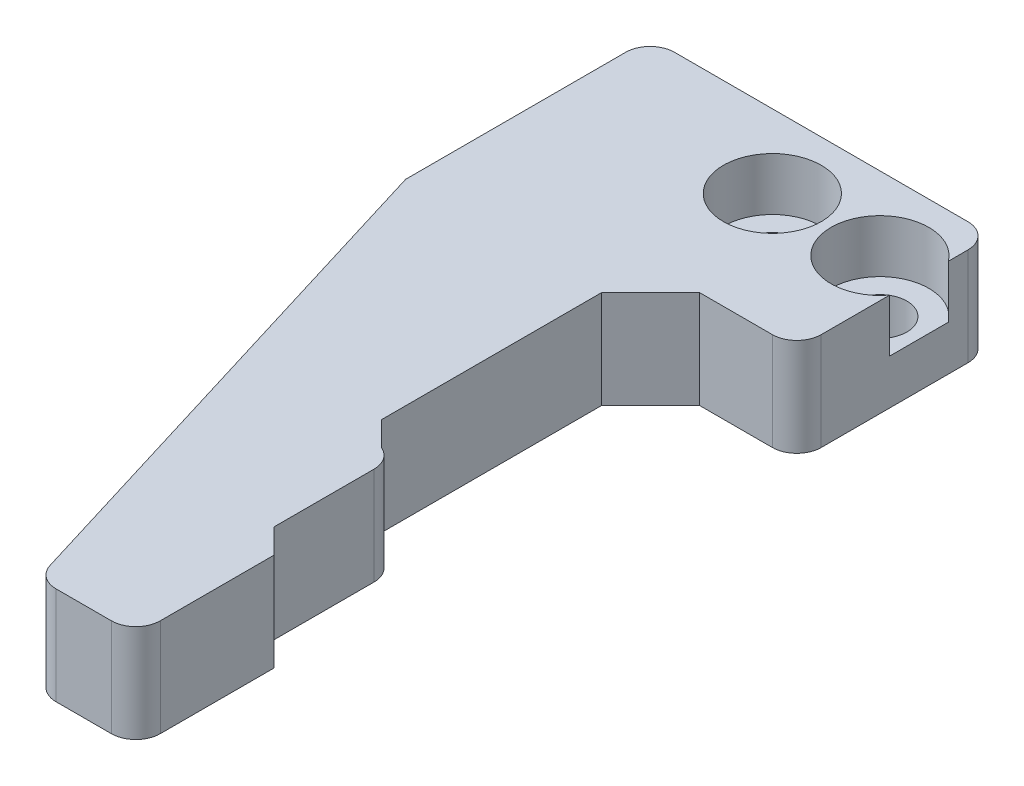
ISO-10303-21;
HEADER;
FILE_DESCRIPTION(('STEP AP214'),'2;1');
FILE_NAME('part.step','',(''),(''),'','','');
FILE_SCHEMA(('AUTOMOTIVE_DESIGN { 1 0 10303 214 1 1 1 1 }'));
ENDSEC;
DATA;
#1=APPLICATION_CONTEXT('core data for automotive mechanical design processes');
#2=APPLICATION_PROTOCOL_DEFINITION('international standard','automotive_design',2000,#1);
#3=PRODUCT_CONTEXT('',#1,'mechanical');
#4=PRODUCT('Part','Part','',(#3));
#5=PRODUCT_RELATED_PRODUCT_CATEGORY('part','',(#4));
#6=PRODUCT_DEFINITION_FORMATION('','',#4);
#7=PRODUCT_DEFINITION_CONTEXT('part definition',#1,'design');
#8=PRODUCT_DEFINITION('design','',#6,#7);
#9=PRODUCT_DEFINITION_SHAPE('','',#8);
#10=(LENGTH_UNIT() NAMED_UNIT(*) SI_UNIT(.MILLI.,.METRE.));
#11=(NAMED_UNIT(*) PLANE_ANGLE_UNIT() SI_UNIT($,.RADIAN.));
#12=(NAMED_UNIT(*) SI_UNIT($,.STERADIAN.) SOLID_ANGLE_UNIT());
#13=UNCERTAINTY_MEASURE_WITH_UNIT(LENGTH_MEASURE(1.E-05),#10,'distance_accuracy_value','');
#14=(GEOMETRIC_REPRESENTATION_CONTEXT(3) GLOBAL_UNCERTAINTY_ASSIGNED_CONTEXT((#13)) GLOBAL_UNIT_ASSIGNED_CONTEXT((#10,
#11,#12)) REPRESENTATION_CONTEXT('',''));
#15=CARTESIAN_POINT('',(0.,0.,0.));
#16=DIRECTION('',(0.,0.,1.));
#17=DIRECTION('',(1.,0.,0.));
#18=AXIS2_PLACEMENT_3D('',#15,#16,#17);
#19=CARTESIAN_POINT('',(0.,10.,-59.1354626519124));
#20=DIRECTION('',(-1.,0.,0.));
#21=DIRECTION('',(0.,0.,1.));
#22=AXIS2_PLACEMENT_3D('',#19,#20,#21);
#23=PLANE('',#22);
#24=DIRECTION('',(0.,0.,1.));
#25=VECTOR('',#24,1.);
#26=CARTESIAN_POINT('',(0.,4.6,-59.1354626519124));
#27=LINE('',#26,#25);
#28=CARTESIAN_POINT('',(0.,4.6,-74.6354626519124));
#29=VERTEX_POINT('',#28);
#30=CARTESIAN_POINT('',(0.,4.6,-68.6354626519124));
#31=VERTEX_POINT('',#30);
#32=EDGE_CURVE('E11',#29,#31,#27,.T.);
#33=ORIENTED_EDGE('',*,*,#32,.T.);
#34=DIRECTION('',(0.,1.,0.));
#35=VECTOR('',#34,1.);
#36=CARTESIAN_POINT('',(0.,10.,-68.6354626519124));
#37=LINE('',#36,#35);
#38=CARTESIAN_POINT('',(0.,10.,-68.6354626519124));
#39=VERTEX_POINT('',#38);
#40=EDGE_CURVE('E173',#31,#39,#37,.T.);
#41=ORIENTED_EDGE('',*,*,#40,.T.);
#42=DIRECTION('',(0.,0.,-1.));
#43=VECTOR('',#42,1.);
#44=CARTESIAN_POINT('',(0.,10.,-59.1354626519124));
#45=LINE('',#44,#43);
#46=CARTESIAN_POINT('',(0.,10.,-61.6354626519124));
#47=VERTEX_POINT('',#46);
#48=EDGE_CURVE('E196',#47,#39,#45,.T.);
#49=ORIENTED_EDGE('',*,*,#48,.F.);
#50=DIRECTION('',(0.,-1.,0.));
#51=VECTOR('',#50,1.);
#52=CARTESIAN_POINT('',(0.,10.,-61.6354626519124));
#53=LINE('',#52,#51);
#54=CARTESIAN_POINT('',(0.,0.,-61.6354626519124));
#55=VERTEX_POINT('',#54);
#56=EDGE_CURVE('E293',#47,#55,#53,.T.);
#57=ORIENTED_EDGE('',*,*,#56,.T.);
#58=DIRECTION('',(0.,0.,-1.));
#59=VECTOR('',#58,1.);
#60=CARTESIAN_POINT('',(0.,0.,-59.1354626519124));
#61=LINE('',#60,#59);
#62=CARTESIAN_POINT('',(0.,0.,-76.6354626519124));
#63=VERTEX_POINT('',#62);
#64=EDGE_CURVE('E180',#55,#63,#61,.T.);
#65=ORIENTED_EDGE('',*,*,#64,.T.);
#66=DIRECTION('',(0.,-1.,0.));
#67=VECTOR('',#66,1.);
#68=CARTESIAN_POINT('',(0.,10.,-76.6354626519124));
#69=LINE('',#68,#67);
#70=CARTESIAN_POINT('',(0.,10.,-76.6354626519124));
#71=VERTEX_POINT('',#70);
#72=EDGE_CURVE('E296',#63,#71,#69,.F.);
#73=ORIENTED_EDGE('',*,*,#72,.T.);
#74=CARTESIAN_POINT('',(0.,10.,-74.6354626519124));
#75=VERTEX_POINT('',#74);
#76=EDGE_CURVE('E189',#75,#71,#45,.T.);
#77=ORIENTED_EDGE('',*,*,#76,.F.);
#78=DIRECTION('',(0.,1.,0.));
#79=VECTOR('',#78,1.);
#80=CARTESIAN_POINT('',(0.,10.,-74.6354626519124));
#81=LINE('',#80,#79);
#82=EDGE_CURVE('E50',#75,#29,#81,.F.);
#83=ORIENTED_EDGE('',*,*,#82,.T.);
#84=EDGE_LOOP('',(#33,#41,#49,#57,#65,#73,#77,#83));
#85=FACE_BOUND('',#84,.T.);
#86=ADVANCED_FACE('F35',(#85),#23,.F.);
#87=CARTESIAN_POINT('',(0.,10.,-79.1354626519124));
#88=DIRECTION('',(0.,0.,1.));
#89=DIRECTION('',(1.,0.,0.));
#90=AXIS2_PLACEMENT_3D('',#87,#88,#89);
#91=PLANE('',#90);
#92=DIRECTION('',(-1.,0.,0.));
#93=VECTOR('',#92,1.);
#94=CARTESIAN_POINT('',(0.,10.,-79.1354626519124));
#95=LINE('',#94,#93);
#96=CARTESIAN_POINT('',(-2.5,10.,-79.1354626519124));
#97=VERTEX_POINT('',#96);
#98=CARTESIAN_POINT('',(-32.5,10.,-79.1354626519124));
#99=VERTEX_POINT('',#98);
#100=EDGE_CURVE('E198',#97,#99,#95,.T.);
#101=ORIENTED_EDGE('',*,*,#100,.F.);
#102=DIRECTION('',(0.,-1.,0.));
#103=VECTOR('',#102,1.);
#104=CARTESIAN_POINT('',(-2.5,10.,-79.1354626519124));
#105=LINE('',#104,#103);
#106=CARTESIAN_POINT('',(-2.5,0.,-79.1354626519124));
#107=VERTEX_POINT('',#106);
#108=EDGE_CURVE('E278',#97,#107,#105,.T.);
#109=ORIENTED_EDGE('',*,*,#108,.T.);
#110=DIRECTION('',(-1.,0.,0.));
#111=VECTOR('',#110,1.);
#112=CARTESIAN_POINT('',(0.,0.,-79.1354626519124));
#113=LINE('',#112,#111);
#114=CARTESIAN_POINT('',(-32.5,0.,-79.1354626519124));
#115=VERTEX_POINT('',#114);
#116=EDGE_CURVE('E221',#107,#115,#113,.T.);
#117=ORIENTED_EDGE('',*,*,#116,.T.);
#118=DIRECTION('',(0.,-1.,0.));
#119=VECTOR('',#118,1.);
#120=CARTESIAN_POINT('',(-32.5,10.,-79.1354626519124));
#121=LINE('',#120,#119);
#122=EDGE_CURVE('E276',#115,#99,#121,.F.);
#123=ORIENTED_EDGE('',*,*,#122,.T.);
#124=EDGE_LOOP('',(#101,#109,#117,#123));
#125=FACE_BOUND('',#124,.T.);
#126=ADVANCED_FACE('F367',(#125),#91,.F.);
#127=CARTESIAN_POINT('',(-35.,10.,-54.1354626519124));
#128=DIRECTION('',(1.,0.,0.));
#129=DIRECTION('',(0.,0.,-1.));
#130=AXIS2_PLACEMENT_3D('',#127,#128,#129);
#131=PLANE('',#130);
#132=DIRECTION('',(0.,0.,1.));
#133=VECTOR('',#132,1.);
#134=CARTESIAN_POINT('',(-35.,10.,-54.1354626519124));
#135=LINE('',#134,#133);
#136=CARTESIAN_POINT('',(-35.,10.,-76.6354626519124));
#137=VERTEX_POINT('',#136);
#138=CARTESIAN_POINT('',(-35.,10.,-54.1354626519124));
#139=VERTEX_POINT('',#138);
#140=EDGE_CURVE('E201',#137,#139,#135,.T.);
#141=ORIENTED_EDGE('',*,*,#140,.F.);
#142=DIRECTION('',(0.,-1.,0.));
#143=VECTOR('',#142,1.);
#144=CARTESIAN_POINT('',(-35.,10.,-76.6354626519124));
#145=LINE('',#144,#143);
#146=CARTESIAN_POINT('',(-35.,0.,-76.6354626519124));
#147=VERTEX_POINT('',#146);
#148=EDGE_CURVE('E320',#137,#147,#145,.T.);
#149=ORIENTED_EDGE('',*,*,#148,.T.);
#150=DIRECTION('',(0.,0.,1.));
#151=VECTOR('',#150,1.);
#152=CARTESIAN_POINT('',(-35.,0.,-54.1354626519124));
#153=LINE('',#152,#151);
#154=CARTESIAN_POINT('',(-35.,0.,-54.1354626519124));
#155=VERTEX_POINT('',#154);
#156=EDGE_CURVE('E224',#147,#155,#153,.T.);
#157=ORIENTED_EDGE('',*,*,#156,.T.);
#158=DIRECTION('',(0.,-1.,0.));
#159=VECTOR('',#158,1.);
#160=CARTESIAN_POINT('',(-35.,10.,-54.1354626519124));
#161=LINE('',#160,#159);
#162=EDGE_CURVE('E243',#139,#155,#161,.T.);
#163=ORIENTED_EDGE('',*,*,#162,.F.);
#164=EDGE_LOOP('',(#141,#149,#157,#163));
#165=FACE_BOUND('',#164,.T.);
#166=ADVANCED_FACE('F377',(#165),#131,.F.);
#167=CARTESIAN_POINT('',(-18.45,10.,0.));
#168=DIRECTION('',(0.956309062202119,0.,-0.292357619278349));
#169=DIRECTION('',(-0.292357619278349,0.,-0.956309062202119));
#170=AXIS2_PLACEMENT_3D('',#167,#168,#169);
#171=PLANE('',#170);
#172=DIRECTION('',(0.292357619278349,0.,0.956309062202119));
#173=VECTOR('',#172,1.);
#174=CARTESIAN_POINT('',(-18.45,0.,0.));
#175=LINE('',#174,#173);
#176=CARTESIAN_POINT('',(-18.9908414755891,0.,-1.76910595180413));
#177=VERTEX_POINT('',#176);
#178=EDGE_CURVE('E226',#155,#177,#175,.T.);
#179=ORIENTED_EDGE('',*,*,#178,.T.);
#180=DIRECTION('',(0.,-1.,0.));
#181=VECTOR('',#180,1.);
#182=CARTESIAN_POINT('',(-18.9908414755891,10.,-1.76910595180413));
#183=LINE('',#182,#181);
#184=CARTESIAN_POINT('',(-18.9908414755891,10.,-1.76910595180413));
#185=VERTEX_POINT('',#184);
#186=EDGE_CURVE('E318',#177,#185,#183,.F.);
#187=ORIENTED_EDGE('',*,*,#186,.T.);
#188=DIRECTION('',(0.292357619278349,0.,0.956309062202119));
#189=VECTOR('',#188,1.);
#190=CARTESIAN_POINT('',(-18.45,10.,0.));
#191=LINE('',#190,#189);
#192=EDGE_CURVE('E203',#139,#185,#191,.T.);
#193=ORIENTED_EDGE('',*,*,#192,.F.);
#194=ORIENTED_EDGE('',*,*,#162,.T.);
#195=EDGE_LOOP('',(#179,#187,#193,#194));
#196=FACE_BOUND('',#195,.T.);
#197=ADVANCED_FACE('F471',(#196),#171,.F.);
#198=CARTESIAN_POINT('',(-8.44999999999999,10.,0.));
#199=DIRECTION('',(0.,0.,-1.));
#200=DIRECTION('',(-1.,0.,0.));
#201=AXIS2_PLACEMENT_3D('',#198,#199,#200);
#202=PLANE('',#201);
#203=DIRECTION('',(1.,0.,0.));
#204=VECTOR('',#203,1.);
#205=CARTESIAN_POINT('',(-8.44999999999999,0.,0.));
#206=LINE('',#205,#204);
#207=CARTESIAN_POINT('',(-16.6000688200838,0.,0.));
#208=VERTEX_POINT('',#207);
#209=CARTESIAN_POINT('',(-10.95,0.,0.));
#210=VERTEX_POINT('',#209);
#211=EDGE_CURVE('E229',#208,#210,#206,.T.);
#212=ORIENTED_EDGE('',*,*,#211,.T.);
#213=DIRECTION('',(0.,-1.,0.));
#214=VECTOR('',#213,1.);
#215=CARTESIAN_POINT('',(-10.95,10.,0.));
#216=LINE('',#215,#214);
#217=CARTESIAN_POINT('',(-10.95,10.,0.));
#218=VERTEX_POINT('',#217);
#219=EDGE_CURVE('E316',#210,#218,#216,.F.);
#220=ORIENTED_EDGE('',*,*,#219,.T.);
#221=DIRECTION('',(1.,0.,0.));
#222=VECTOR('',#221,1.);
#223=CARTESIAN_POINT('',(-8.44999999999999,10.,0.));
#224=LINE('',#223,#222);
#225=CARTESIAN_POINT('',(-16.6000688200838,10.,0.));
#226=VERTEX_POINT('',#225);
#227=EDGE_CURVE('E206',#226,#218,#224,.T.);
#228=ORIENTED_EDGE('',*,*,#227,.F.);
#229=DIRECTION('',(0.,-1.,0.));
#230=VECTOR('',#229,1.);
#231=CARTESIAN_POINT('',(-16.6000688200838,10.,0.));
#232=LINE('',#231,#230);
#233=EDGE_CURVE('E313',#226,#208,#232,.T.);
#234=ORIENTED_EDGE('',*,*,#233,.T.);
#235=EDGE_LOOP('',(#212,#220,#228,#234));
#236=FACE_BOUND('',#235,.T.);
#237=ADVANCED_FACE('F389',(#236),#202,.F.);
#238=CARTESIAN_POINT('',(-8.44999999999999,10.,-14.1354626519124));
#239=DIRECTION('',(-1.,0.,0.));
#240=DIRECTION('',(0.,0.,1.));
#241=AXIS2_PLACEMENT_3D('',#238,#239,#240);
#242=PLANE('',#241);
#243=DIRECTION('',(0.,0.,-1.));
#244=VECTOR('',#243,1.);
#245=CARTESIAN_POINT('',(-8.44999999999999,10.,-14.1354626519124));
#246=LINE('',#245,#244);
#247=CARTESIAN_POINT('',(-8.44999999999999,10.,-2.5));
#248=VERTEX_POINT('',#247);
#249=CARTESIAN_POINT('',(-8.44999999999999,10.,-14.1354626519124));
#250=VERTEX_POINT('',#249);
#251=EDGE_CURVE('E209',#248,#250,#246,.T.);
#252=ORIENTED_EDGE('',*,*,#251,.F.);
#253=DIRECTION('',(0.,-1.,0.));
#254=VECTOR('',#253,1.);
#255=CARTESIAN_POINT('',(-8.44999999999999,10.,-2.5));
#256=LINE('',#255,#254);
#257=CARTESIAN_POINT('',(-8.44999999999999,0.,-2.5));
#258=VERTEX_POINT('',#257);
#259=EDGE_CURVE('E310',#248,#258,#256,.T.);
#260=ORIENTED_EDGE('',*,*,#259,.T.);
#261=DIRECTION('',(0.,0.,-1.));
#262=VECTOR('',#261,1.);
#263=CARTESIAN_POINT('',(-8.44999999999999,0.,-14.1354626519124));
#264=LINE('',#263,#262);
#265=CARTESIAN_POINT('',(-8.44999999999999,0.,-14.1354626519124));
#266=VERTEX_POINT('',#265);
#267=EDGE_CURVE('E232',#258,#266,#264,.T.);
#268=ORIENTED_EDGE('',*,*,#267,.T.);
#269=DIRECTION('',(0.,-1.,0.));
#270=VECTOR('',#269,1.);
#271=CARTESIAN_POINT('',(-8.44999999999999,10.,-14.1354626519124));
#272=LINE('',#271,#270);
#273=EDGE_CURVE('E218',#250,#266,#272,.T.);
#274=ORIENTED_EDGE('',*,*,#273,.F.);
#275=EDGE_LOOP('',(#252,#260,#268,#274));
#276=FACE_BOUND('',#275,.T.);
#277=ADVANCED_FACE('F398',(#276),#242,.F.);
#278=CARTESIAN_POINT('',(-10.95,10.,-29.1354626519124));
#279=DIRECTION('',(-1.,0.,0.));
#280=DIRECTION('',(0.,0.,1.));
#281=AXIS2_PLACEMENT_3D('',#278,#279,#280);
#282=PLANE('',#281);
#283=DIRECTION('',(0.,0.,-1.));
#284=VECTOR('',#283,1.);
#285=CARTESIAN_POINT('',(-10.95,0.,-29.1354626519124));
#286=LINE('',#285,#284);
#287=CARTESIAN_POINT('',(-10.95,0.,-16.6354626519124));
#288=VERTEX_POINT('',#287);
#289=CARTESIAN_POINT('',(-10.95,0.,-26.8441748044345));
#290=VERTEX_POINT('',#289);
#291=EDGE_CURVE('E234',#288,#290,#286,.T.);
#292=ORIENTED_EDGE('',*,*,#291,.T.);
#293=DIRECTION('',(0.,1.,0.));
#294=VECTOR('',#293,1.);
#295=CARTESIAN_POINT('',(-10.95,10.,-26.8441748044345));
#296=LINE('',#295,#294);
#297=CARTESIAN_POINT('',(-10.95,10.,-26.8441748044345));
#298=VERTEX_POINT('',#297);
#299=EDGE_CURVE('E324',#290,#298,#296,.T.);
#300=ORIENTED_EDGE('',*,*,#299,.T.);
#301=DIRECTION('',(0.,0.,-1.));
#302=VECTOR('',#301,1.);
#303=CARTESIAN_POINT('',(-10.95,10.,-29.1354626519124));
#304=LINE('',#303,#302);
#305=CARTESIAN_POINT('',(-10.95,10.,-16.6354626519124));
#306=VERTEX_POINT('',#305);
#307=EDGE_CURVE('E211',#306,#298,#304,.T.);
#308=ORIENTED_EDGE('',*,*,#307,.F.);
#309=DIRECTION('',(0.,-1.,0.));
#310=VECTOR('',#309,1.);
#311=CARTESIAN_POINT('',(-10.95,0.,-16.6354626519124));
#312=LINE('',#311,#310);
#313=EDGE_CURVE('E257',#306,#288,#312,.T.);
#314=ORIENTED_EDGE('',*,*,#313,.T.);
#315=EDGE_LOOP('',(#292,#300,#308,#314));
#316=FACE_BOUND('',#315,.T.);
#317=ADVANCED_FACE('F328',(#316),#282,.F.);
#318=CARTESIAN_POINT('',(-14.95,10.,-59.1354626519124));
#319=DIRECTION('',(-1.,0.,0.));
#320=DIRECTION('',(0.,0.,1.));
#321=AXIS2_PLACEMENT_3D('',#318,#319,#320);
#322=PLANE('',#321);
#323=DIRECTION('',(0.,0.,-1.));
#324=VECTOR('',#323,1.);
#325=CARTESIAN_POINT('',(-14.95,10.,-59.1354626519124));
#326=LINE('',#325,#324);
#327=CARTESIAN_POINT('',(-14.95,10.,-31.6354626519124));
#328=VERTEX_POINT('',#327);
#329=CARTESIAN_POINT('',(-14.95,10.,-54.1354626519124));
#330=VERTEX_POINT('',#329);
#331=EDGE_CURVE('E214',#328,#330,#326,.T.);
#332=ORIENTED_EDGE('',*,*,#331,.F.);
#333=DIRECTION('',(0.,-1.,0.));
#334=VECTOR('',#333,1.);
#335=CARTESIAN_POINT('',(-14.95,0.,-31.6354626519124));
#336=LINE('',#335,#334);
#337=CARTESIAN_POINT('',(-14.95,0.,-31.6354626519124));
#338=VERTEX_POINT('',#337);
#339=EDGE_CURVE('E260',#328,#338,#336,.T.);
#340=ORIENTED_EDGE('',*,*,#339,.T.);
#341=DIRECTION('',(0.,0.,-1.));
#342=VECTOR('',#341,1.);
#343=CARTESIAN_POINT('',(-14.95,0.,-59.1354626519124));
#344=LINE('',#343,#342);
#345=CARTESIAN_POINT('',(-14.95,0.,-54.1354626519124));
#346=VERTEX_POINT('',#345);
#347=EDGE_CURVE('E237',#338,#346,#344,.T.);
#348=ORIENTED_EDGE('',*,*,#347,.T.);
#349=DIRECTION('',(0.,1.,0.));
#350=VECTOR('',#349,1.);
#351=CARTESIAN_POINT('',(-14.95,10.,-54.1354626519124));
#352=LINE('',#351,#350);
#353=EDGE_CURVE('E249',#346,#330,#352,.T.);
#354=ORIENTED_EDGE('',*,*,#353,.T.);
#355=EDGE_LOOP('',(#332,#340,#348,#354));
#356=FACE_BOUND('',#355,.T.);
#357=ADVANCED_FACE('F343',(#356),#322,.F.);
#358=CARTESIAN_POINT('',(0.,10.,-59.1354626519124));
#359=DIRECTION('',(0.,0.,-1.));
#360=DIRECTION('',(-1.,0.,0.));
#361=AXIS2_PLACEMENT_3D('',#358,#359,#360);
#362=PLANE('',#361);
#363=DIRECTION('',(1.,0.,0.));
#364=VECTOR('',#363,1.);
#365=CARTESIAN_POINT('',(0.,0.,-59.1354626519124));
#366=LINE('',#365,#364);
#367=CARTESIAN_POINT('',(-9.94999999999997,0.,-59.1354626519124));
#368=VERTEX_POINT('',#367);
#369=CARTESIAN_POINT('',(-2.5,0.,-59.1354626519124));
#370=VERTEX_POINT('',#369);
#371=EDGE_CURVE('E239',#368,#370,#366,.T.);
#372=ORIENTED_EDGE('',*,*,#371,.T.);
#373=DIRECTION('',(0.,-1.,0.));
#374=VECTOR('',#373,1.);
#375=CARTESIAN_POINT('',(-2.5,10.,-59.1354626519124));
#376=LINE('',#375,#374);
#377=CARTESIAN_POINT('',(-2.5,10.,-59.1354626519124));
#378=VERTEX_POINT('',#377);
#379=EDGE_CURVE('E58',#370,#378,#376,.F.);
#380=ORIENTED_EDGE('',*,*,#379,.T.);
#381=DIRECTION('',(1.,0.,0.));
#382=VECTOR('',#381,1.);
#383=CARTESIAN_POINT('',(0.,10.,-59.1354626519124));
#384=LINE('',#383,#382);
#385=CARTESIAN_POINT('',(-9.94999999999997,10.,-59.1354626519124));
#386=VERTEX_POINT('',#385);
#387=EDGE_CURVE('E216',#386,#378,#384,.T.);
#388=ORIENTED_EDGE('',*,*,#387,.F.);
#389=DIRECTION('',(0.,-1.,0.));
#390=VECTOR('',#389,1.);
#391=CARTESIAN_POINT('',(-9.94999999999997,0.,-59.1354626519124));
#392=LINE('',#391,#390);
#393=EDGE_CURVE('E246',#386,#368,#392,.T.);
#394=ORIENTED_EDGE('',*,*,#393,.T.);
#395=EDGE_LOOP('',(#372,#380,#388,#394));
#396=FACE_BOUND('',#395,.T.);
#397=ADVANCED_FACE('F351',(#396),#362,.F.);
#398=CARTESIAN_POINT('',(0.,10.,0.));
#399=DIRECTION('',(0.,1.,0.));
#400=DIRECTION('',(0.,0.,1.));
#401=AXIS2_PLACEMENT_3D('',#398,#399,#400);
#402=PLANE('',#401);
#403=CARTESIAN_POINT('',(-15.,10.,-71.6354626519124));
#404=DIRECTION('',(0.,1.,0.));
#405=DIRECTION('',(0.,0.,1.));
#406=AXIS2_PLACEMENT_3D('',#403,#404,#405);
#407=CIRCLE('',#406,4.99999999999999);
#408=CARTESIAN_POINT('',(-15.,10.,-66.6354626519124));
#409=VERTEX_POINT('',#408);
#410=EDGE_CURVE('E607',#409,#409,#407,.T.);
#411=ORIENTED_EDGE('',*,*,#410,.F.);
#412=EDGE_LOOP('',(#411));
#413=FACE_BOUND('',#412,.T.);
#414=CARTESIAN_POINT('',(-3.99999999999999,10.,-71.6354626519124));
#415=DIRECTION('',(0.,1.,0.));
#416=DIRECTION('',(0.,0.,1.));
#417=AXIS2_PLACEMENT_3D('',#414,#415,#416);
#418=CIRCLE('',#417,4.99999999999999);
#419=EDGE_CURVE('E43',#75,#39,#418,.T.);
#420=ORIENTED_EDGE('',*,*,#419,.F.);
#421=ORIENTED_EDGE('',*,*,#76,.T.);
#422=CARTESIAN_POINT('',(-2.5,10.,-76.6354626519124));
#423=DIRECTION('',(0.,1.,0.));
#424=DIRECTION('',(0.,0.,1.));
#425=AXIS2_PLACEMENT_3D('',#422,#423,#424);
#426=CIRCLE('',#425,2.5);
#427=EDGE_CURVE('E308',#71,#97,#426,.T.);
#428=ORIENTED_EDGE('',*,*,#427,.T.);
#429=ORIENTED_EDGE('',*,*,#100,.T.);
#430=CARTESIAN_POINT('',(-32.5,10.,-76.6354626519124));
#431=DIRECTION('',(0.,1.,0.));
#432=DIRECTION('',(0.,0.,1.));
#433=AXIS2_PLACEMENT_3D('',#430,#431,#432);
#434=CIRCLE('',#433,2.5);
#435=EDGE_CURVE('E302',#99,#137,#434,.T.);
#436=ORIENTED_EDGE('',*,*,#435,.T.);
#437=ORIENTED_EDGE('',*,*,#140,.T.);
#438=ORIENTED_EDGE('',*,*,#192,.T.);
#439=CARTESIAN_POINT('',(-16.6000688200838,10.,-2.5));
#440=DIRECTION('',(0.,1.,0.));
#441=DIRECTION('',(0.,0.,1.));
#442=AXIS2_PLACEMENT_3D('',#439,#440,#441);
#443=CIRCLE('',#442,2.5);
#444=EDGE_CURVE('E304',#185,#226,#443,.T.);
#445=ORIENTED_EDGE('',*,*,#444,.T.);
#446=ORIENTED_EDGE('',*,*,#227,.T.);
#447=CARTESIAN_POINT('',(-10.95,10.,-2.5));
#448=DIRECTION('',(0.,1.,0.));
#449=DIRECTION('',(0.,0.,1.));
#450=AXIS2_PLACEMENT_3D('',#447,#448,#449);
#451=CIRCLE('',#450,2.5);
#452=EDGE_CURVE('E306',#218,#248,#451,.T.);
#453=ORIENTED_EDGE('',*,*,#452,.T.);
#454=ORIENTED_EDGE('',*,*,#251,.T.);
#455=DIRECTION('',(0.707106781186544,0.,0.707106781186551));
#456=VECTOR('',#455,1.);
#457=CARTESIAN_POINT('',(-10.95,10.,-16.6354626519124));
#458=LINE('',#457,#456);
#459=EDGE_CURVE('E269',#250,#306,#458,.F.);
#460=ORIENTED_EDGE('',*,*,#459,.T.);
#461=ORIENTED_EDGE('',*,*,#307,.T.);
#462=CARTESIAN_POINT('',(-13.45,10.,-26.8441748044345));
#463=DIRECTION('',(0.,1.,0.));
#464=DIRECTION('',(0.,0.,1.));
#465=AXIS2_PLACEMENT_3D('',#462,#463,#464);
#466=CIRCLE('',#465,2.5);
#467=CARTESIAN_POINT('',(-12.45,10.,-29.1354626519124));
#468=VERTEX_POINT('',#467);
#469=EDGE_CURVE('E298',#298,#468,#466,.T.);
#470=ORIENTED_EDGE('',*,*,#469,.T.);
#471=DIRECTION('',(0.707106781186543,0.,0.707106781186552));
#472=VECTOR('',#471,1.);
#473=CARTESIAN_POINT('',(-14.95,10.,-31.6354626519124));
#474=LINE('',#473,#472);
#475=EDGE_CURVE('E274',#468,#328,#474,.F.);
#476=ORIENTED_EDGE('',*,*,#475,.T.);
#477=ORIENTED_EDGE('',*,*,#331,.T.);
#478=DIRECTION('',(-0.707106781186551,0.,0.707106781186544));
#479=VECTOR('',#478,1.);
#480=CARTESIAN_POINT('',(-9.94999999999997,10.,-59.1354626519124));
#481=LINE('',#480,#479);
#482=EDGE_CURVE('E255',#330,#386,#481,.F.);
#483=ORIENTED_EDGE('',*,*,#482,.T.);
#484=ORIENTED_EDGE('',*,*,#387,.T.);
#485=CARTESIAN_POINT('',(-2.5,10.,-61.6354626519124));
#486=DIRECTION('',(0.,1.,0.));
#487=DIRECTION('',(0.,0.,1.));
#488=AXIS2_PLACEMENT_3D('',#485,#486,#487);
#489=CIRCLE('',#488,2.5);
#490=EDGE_CURVE('E300',#378,#47,#489,.T.);
#491=ORIENTED_EDGE('',*,*,#490,.T.);
#492=ORIENTED_EDGE('',*,*,#48,.T.);
#493=EDGE_LOOP('',(#420,#421,#428,#429,#436,#437,#438,#445,#446,#453,#454,#460,#461,#470,#476,
#477,#483,#484,#491,#492));
#494=FACE_BOUND('',#493,.T.);
#495=ADVANCED_FACE('F334',(#413,#494),#402,.T.);
#496=CARTESIAN_POINT('',(0.,0.,0.));
#497=DIRECTION('',(0.,1.,0.));
#498=DIRECTION('',(0.,0.,1.));
#499=AXIS2_PLACEMENT_3D('',#496,#497,#498);
#500=PLANE('',#499);
#501=CARTESIAN_POINT('',(-15.,0.,-71.6354626519124));
#502=DIRECTION('',(0.,1.,0.));
#503=DIRECTION('',(0.,0.,1.));
#504=AXIS2_PLACEMENT_3D('',#501,#502,#503);
#505=CIRCLE('',#504,2.75);
#506=CARTESIAN_POINT('',(-15.,0.,-68.8854626519124));
#507=VERTEX_POINT('',#506);
#508=EDGE_CURVE('E185',#507,#507,#505,.T.);
#509=ORIENTED_EDGE('',*,*,#508,.T.);
#510=EDGE_LOOP('',(#509));
#511=FACE_BOUND('',#510,.T.);
#512=CARTESIAN_POINT('',(-3.99999999999999,0.,-71.6354626519124));
#513=DIRECTION('',(0.,1.,0.));
#514=DIRECTION('',(0.,0.,1.));
#515=AXIS2_PLACEMENT_3D('',#512,#513,#514);
#516=CIRCLE('',#515,2.75);
#517=CARTESIAN_POINT('',(-3.99999999999999,0.,-68.8854626519124));
#518=VERTEX_POINT('',#517);
#519=EDGE_CURVE('E190',#518,#518,#516,.T.);
#520=ORIENTED_EDGE('',*,*,#519,.T.);
#521=EDGE_LOOP('',(#520));
#522=FACE_BOUND('',#521,.T.);
#523=ORIENTED_EDGE('',*,*,#116,.F.);
#524=CARTESIAN_POINT('',(-2.5,0.,-76.6354626519124));
#525=DIRECTION('',(0.,1.,0.));
#526=DIRECTION('',(0.,0.,1.));
#527=AXIS2_PLACEMENT_3D('',#524,#525,#526);
#528=CIRCLE('',#527,2.5);
#529=EDGE_CURVE('E291',#107,#63,#528,.F.);
#530=ORIENTED_EDGE('',*,*,#529,.T.);
#531=ORIENTED_EDGE('',*,*,#64,.F.);
#532=CARTESIAN_POINT('',(-2.5,0.,-61.6354626519124));
#533=DIRECTION('',(0.,1.,0.));
#534=DIRECTION('',(0.,0.,1.));
#535=AXIS2_PLACEMENT_3D('',#532,#533,#534);
#536=CIRCLE('',#535,2.5);
#537=EDGE_CURVE('E283',#55,#370,#536,.F.);
#538=ORIENTED_EDGE('',*,*,#537,.T.);
#539=ORIENTED_EDGE('',*,*,#371,.F.);
#540=DIRECTION('',(0.707106781186551,0.,-0.707106781186544));
#541=VECTOR('',#540,1.);
#542=CARTESIAN_POINT('',(-34.5427313259561,0.,-34.5427313259565));
#543=LINE('',#542,#541);
#544=EDGE_CURVE('E252',#368,#346,#543,.F.);
#545=ORIENTED_EDGE('',*,*,#544,.T.);
#546=ORIENTED_EDGE('',*,*,#347,.F.);
#547=DIRECTION('',(-0.707106781186543,0.,-0.707106781186552));
#548=VECTOR('',#547,1.);
#549=CARTESIAN_POINT('',(8.34273132595611,0.,-8.342731325956));
#550=LINE('',#549,#548);
#551=CARTESIAN_POINT('',(-12.45,0.,-29.1354626519124));
#552=VERTEX_POINT('',#551);
#553=EDGE_CURVE('E271',#338,#552,#550,.F.);
#554=ORIENTED_EDGE('',*,*,#553,.T.);
#555=CARTESIAN_POINT('',(-13.45,0.,-26.8441748044345));
#556=DIRECTION('',(0.,1.,0.));
#557=DIRECTION('',(0.,0.,1.));
#558=AXIS2_PLACEMENT_3D('',#555,#556,#557);
#559=CIRCLE('',#558,2.5);
#560=EDGE_CURVE('E281',#552,#290,#559,.F.);
#561=ORIENTED_EDGE('',*,*,#560,.T.);
#562=ORIENTED_EDGE('',*,*,#291,.F.);
#563=DIRECTION('',(-0.707106781186544,0.,-0.707106781186551));
#564=VECTOR('',#563,1.);
#565=CARTESIAN_POINT('',(2.84273132595616,0.,-2.84273132595613));
#566=LINE('',#565,#564);
#567=EDGE_CURVE('E266',#288,#266,#566,.F.);
#568=ORIENTED_EDGE('',*,*,#567,.T.);
#569=ORIENTED_EDGE('',*,*,#267,.F.);
#570=CARTESIAN_POINT('',(-10.95,0.,-2.5));
#571=DIRECTION('',(0.,1.,0.));
#572=DIRECTION('',(0.,0.,1.));
#573=AXIS2_PLACEMENT_3D('',#570,#571,#572);
#574=CIRCLE('',#573,2.5);
#575=EDGE_CURVE('E289',#258,#210,#574,.F.);
#576=ORIENTED_EDGE('',*,*,#575,.T.);
#577=ORIENTED_EDGE('',*,*,#211,.F.);
#578=CARTESIAN_POINT('',(-16.6000688200838,0.,-2.5));
#579=DIRECTION('',(0.,1.,0.));
#580=DIRECTION('',(0.,0.,1.));
#581=AXIS2_PLACEMENT_3D('',#578,#579,#580);
#582=CIRCLE('',#581,2.5);
#583=EDGE_CURVE('E287',#208,#177,#582,.F.);
#584=ORIENTED_EDGE('',*,*,#583,.T.);
#585=ORIENTED_EDGE('',*,*,#178,.F.);
#586=ORIENTED_EDGE('',*,*,#156,.F.);
#587=CARTESIAN_POINT('',(-32.5,0.,-76.6354626519124));
#588=DIRECTION('',(0.,1.,0.));
#589=DIRECTION('',(0.,0.,1.));
#590=AXIS2_PLACEMENT_3D('',#587,#588,#589);
#591=CIRCLE('',#590,2.5);
#592=EDGE_CURVE('E285',#147,#115,#591,.F.);
#593=ORIENTED_EDGE('',*,*,#592,.T.);
#594=EDGE_LOOP('',(#523,#530,#531,#538,#539,#545,#546,#554,#561,#562,#568,#569,#576,#577,#584,
#585,#586,#593));
#595=FACE_BOUND('',#594,.T.);
#596=ADVANCED_FACE('F355',(#511,#522,#595),#500,.F.);
#597=CARTESIAN_POINT('',(-9.94999999999997,10.,-59.1354626519124));
#598=DIRECTION('',(0.707106781186544,0.,0.707106781186551));
#599=DIRECTION('',(0.,1.,0.));
#600=AXIS2_PLACEMENT_3D('',#597,#598,#599);
#601=PLANE('',#600);
#602=ORIENTED_EDGE('',*,*,#482,.F.);
#603=ORIENTED_EDGE('',*,*,#353,.F.);
#604=ORIENTED_EDGE('',*,*,#544,.F.);
#605=ORIENTED_EDGE('',*,*,#393,.F.);
#606=EDGE_LOOP('',(#602,#603,#604,#605));
#607=FACE_BOUND('',#606,.T.);
#608=ADVANCED_FACE('F349',(#607),#601,.T.);
#609=CARTESIAN_POINT('',(-10.95,10.,-16.6354626519124));
#610=DIRECTION('',(0.707106781186551,0.,-0.707106781186543));
#611=DIRECTION('',(0.,1.,0.));
#612=AXIS2_PLACEMENT_3D('',#609,#610,#611);
#613=PLANE('',#612);
#614=ORIENTED_EDGE('',*,*,#459,.F.);
#615=ORIENTED_EDGE('',*,*,#273,.T.);
#616=ORIENTED_EDGE('',*,*,#567,.F.);
#617=ORIENTED_EDGE('',*,*,#313,.F.);
#618=EDGE_LOOP('',(#614,#615,#616,#617));
#619=FACE_BOUND('',#618,.T.);
#620=ADVANCED_FACE('F401',(#619),#613,.T.);
#621=CARTESIAN_POINT('',(-14.95,10.,-31.6354626519124));
#622=DIRECTION('',(0.707106781186552,0.,-0.707106781186543));
#623=DIRECTION('',(0.,1.,0.));
#624=AXIS2_PLACEMENT_3D('',#621,#622,#623);
#625=PLANE('',#624);
#626=ORIENTED_EDGE('',*,*,#475,.F.);
#627=DIRECTION('',(0.,1.,0.));
#628=VECTOR('',#627,1.);
#629=CARTESIAN_POINT('',(-12.45,10.,-29.1354626519124));
#630=LINE('',#629,#628);
#631=EDGE_CURVE('E263',#552,#468,#630,.T.);
#632=ORIENTED_EDGE('',*,*,#631,.F.);
#633=ORIENTED_EDGE('',*,*,#553,.F.);
#634=ORIENTED_EDGE('',*,*,#339,.F.);
#635=EDGE_LOOP('',(#626,#632,#633,#634));
#636=FACE_BOUND('',#635,.T.);
#637=ADVANCED_FACE('F339',(#636),#625,.T.);
#638=CARTESIAN_POINT('',(-2.5,10.,-76.6354626519124));
#639=DIRECTION('',(0.,-1.,0.));
#640=DIRECTION('',(0.,0.,-1.));
#641=AXIS2_PLACEMENT_3D('',#638,#639,#640);
#642=CYLINDRICAL_SURFACE('',#641,2.5);
#643=ORIENTED_EDGE('',*,*,#427,.F.);
#644=ORIENTED_EDGE('',*,*,#72,.F.);
#645=ORIENTED_EDGE('',*,*,#529,.F.);
#646=ORIENTED_EDGE('',*,*,#108,.F.);
#647=EDGE_LOOP('',(#643,#644,#645,#646));
#648=FACE_BOUND('',#647,.T.);
#649=ADVANCED_FACE('F365',(#648),#642,.T.);
#650=CARTESIAN_POINT('',(-10.95,10.,-2.5));
#651=DIRECTION('',(0.,-1.,0.));
#652=DIRECTION('',(0.,0.,-1.));
#653=AXIS2_PLACEMENT_3D('',#650,#651,#652);
#654=CYLINDRICAL_SURFACE('',#653,2.5);
#655=ORIENTED_EDGE('',*,*,#452,.F.);
#656=ORIENTED_EDGE('',*,*,#219,.F.);
#657=ORIENTED_EDGE('',*,*,#575,.F.);
#658=ORIENTED_EDGE('',*,*,#259,.F.);
#659=EDGE_LOOP('',(#655,#656,#657,#658));
#660=FACE_BOUND('',#659,.T.);
#661=ADVANCED_FACE('F395',(#660),#654,.T.);
#662=CARTESIAN_POINT('',(-16.6000688200838,10.,-2.5));
#663=DIRECTION('',(0.,-1.,0.));
#664=DIRECTION('',(0.,0.,-1.));
#665=AXIS2_PLACEMENT_3D('',#662,#663,#664);
#666=CYLINDRICAL_SURFACE('',#665,2.5);
#667=ORIENTED_EDGE('',*,*,#444,.F.);
#668=ORIENTED_EDGE('',*,*,#186,.F.);
#669=ORIENTED_EDGE('',*,*,#583,.F.);
#670=ORIENTED_EDGE('',*,*,#233,.F.);
#671=EDGE_LOOP('',(#667,#668,#669,#670));
#672=FACE_BOUND('',#671,.T.);
#673=ADVANCED_FACE('F386',(#672),#666,.T.);
#674=CARTESIAN_POINT('',(-32.5,10.,-76.6354626519124));
#675=DIRECTION('',(0.,-1.,0.));
#676=DIRECTION('',(0.,0.,-1.));
#677=AXIS2_PLACEMENT_3D('',#674,#675,#676);
#678=CYLINDRICAL_SURFACE('',#677,2.5);
#679=ORIENTED_EDGE('',*,*,#435,.F.);
#680=ORIENTED_EDGE('',*,*,#122,.F.);
#681=ORIENTED_EDGE('',*,*,#592,.F.);
#682=ORIENTED_EDGE('',*,*,#148,.F.);
#683=EDGE_LOOP('',(#679,#680,#681,#682));
#684=FACE_BOUND('',#683,.T.);
#685=ADVANCED_FACE('F374',(#684),#678,.T.);
#686=CARTESIAN_POINT('',(-2.5,10.,-61.6354626519124));
#687=DIRECTION('',(0.,-1.,0.));
#688=DIRECTION('',(0.,0.,-1.));
#689=AXIS2_PLACEMENT_3D('',#686,#687,#688);
#690=CYLINDRICAL_SURFACE('',#689,2.5);
#691=ORIENTED_EDGE('',*,*,#490,.F.);
#692=ORIENTED_EDGE('',*,*,#379,.F.);
#693=ORIENTED_EDGE('',*,*,#537,.F.);
#694=ORIENTED_EDGE('',*,*,#56,.F.);
#695=EDGE_LOOP('',(#691,#692,#693,#694));
#696=FACE_BOUND('',#695,.T.);
#697=ADVANCED_FACE('F359',(#696),#690,.T.);
#698=CARTESIAN_POINT('',(-13.45,10.,-26.8441748044345));
#699=DIRECTION('',(0.,1.,0.));
#700=DIRECTION('',(0.,0.,1.));
#701=AXIS2_PLACEMENT_3D('',#698,#699,#700);
#702=CYLINDRICAL_SURFACE('',#701,2.5);
#703=ORIENTED_EDGE('',*,*,#469,.F.);
#704=ORIENTED_EDGE('',*,*,#299,.F.);
#705=ORIENTED_EDGE('',*,*,#560,.F.);
#706=ORIENTED_EDGE('',*,*,#631,.T.);
#707=EDGE_LOOP('',(#703,#704,#705,#706));
#708=FACE_BOUND('',#707,.T.);
#709=ADVANCED_FACE('F37',(#708),#702,.T.);
#710=CARTESIAN_POINT('',(-1.24999999999999,4.6,-71.6354626519124));
#711=DIRECTION('',(0.,-1.,0.));
#712=DIRECTION('',(0.,0.,-1.));
#713=AXIS2_PLACEMENT_3D('',#710,#711,#712);
#714=PLANE('',#713);
#715=CARTESIAN_POINT('',(-3.99999999999999,4.6,-71.6354626519124));
#716=DIRECTION('',(0.,1.,0.));
#717=DIRECTION('',(0.,0.,1.));
#718=AXIS2_PLACEMENT_3D('',#715,#716,#717);
#719=CIRCLE('',#718,2.75);
#720=CARTESIAN_POINT('',(-3.99999999999999,4.6,-68.8854626519124));
#721=VERTEX_POINT('',#720);
#722=EDGE_CURVE('E184',#721,#721,#719,.T.);
#723=ORIENTED_EDGE('',*,*,#722,.F.);
#724=EDGE_LOOP('',(#723));
#725=FACE_BOUND('',#724,.T.);
#726=CARTESIAN_POINT('',(-3.99999999999999,4.6,-71.6354626519124));
#727=DIRECTION('',(0.,1.,0.));
#728=DIRECTION('',(0.,0.,1.));
#729=AXIS2_PLACEMENT_3D('',#726,#727,#728);
#730=CIRCLE('',#729,4.99999999999999);
#731=EDGE_CURVE('E176',#29,#31,#730,.T.);
#732=ORIENTED_EDGE('',*,*,#731,.T.);
#733=ORIENTED_EDGE('',*,*,#32,.F.);
#734=EDGE_LOOP('',(#732,#733));
#735=FACE_BOUND('',#734,.T.);
#736=ADVANCED_FACE('F183',(#725,#735),#714,.F.);
#737=CARTESIAN_POINT('',(-3.99999999999999,10.,-71.6354626519124));
#738=DIRECTION('',(0.,1.,0.));
#739=DIRECTION('',(0.,0.,1.));
#740=AXIS2_PLACEMENT_3D('',#737,#738,#739);
#741=CYLINDRICAL_SURFACE('',#740,4.99999999999999);
#742=ORIENTED_EDGE('',*,*,#731,.F.);
#743=ORIENTED_EDGE('',*,*,#82,.F.);
#744=ORIENTED_EDGE('',*,*,#419,.T.);
#745=ORIENTED_EDGE('',*,*,#40,.F.);
#746=EDGE_LOOP('',(#742,#743,#744,#745));
#747=FACE_BOUND('',#746,.T.);
#748=ADVANCED_FACE('F175',(#747),#741,.F.);
#749=CARTESIAN_POINT('',(-3.99999999999999,10.,-71.6354626519124));
#750=DIRECTION('',(0.,1.,0.));
#751=DIRECTION('',(0.,0.,1.));
#752=AXIS2_PLACEMENT_3D('',#749,#750,#751);
#753=CYLINDRICAL_SURFACE('',#752,2.75);
#754=ORIENTED_EDGE('',*,*,#519,.F.);
#755=EDGE_LOOP('',(#754));
#756=FACE_BOUND('',#755,.T.);
#757=ORIENTED_EDGE('',*,*,#722,.T.);
#758=EDGE_LOOP('',(#757));
#759=FACE_BOUND('',#758,.T.);
#760=ADVANCED_FACE('F446',(#756,#759),#753,.F.);
#761=CARTESIAN_POINT('',(-15.,10.,-71.6354626519124));
#762=DIRECTION('',(0.,1.,0.));
#763=DIRECTION('',(0.,0.,1.));
#764=AXIS2_PLACEMENT_3D('',#761,#762,#763);
#765=CYLINDRICAL_SURFACE('',#764,2.75);
#766=ORIENTED_EDGE('',*,*,#508,.F.);
#767=EDGE_LOOP('',(#766));
#768=FACE_BOUND('',#767,.T.);
#769=CARTESIAN_POINT('',(-15.,4.6,-71.6354626519124));
#770=DIRECTION('',(0.,1.,0.));
#771=DIRECTION('',(0.,0.,1.));
#772=AXIS2_PLACEMENT_3D('',#769,#770,#771);
#773=CIRCLE('',#772,2.75);
#774=CARTESIAN_POINT('',(-15.,4.6,-68.8854626519124));
#775=VERTEX_POINT('',#774);
#776=EDGE_CURVE('E609',#775,#775,#773,.T.);
#777=ORIENTED_EDGE('',*,*,#776,.T.);
#778=EDGE_LOOP('',(#777));
#779=FACE_BOUND('',#778,.T.);
#780=ADVANCED_FACE('F453',(#768,#779),#765,.F.);
#781=CARTESIAN_POINT('',(-12.25,4.6,-71.6354626519124));
#782=DIRECTION('',(0.,-1.,0.));
#783=DIRECTION('',(0.,0.,-1.));
#784=AXIS2_PLACEMENT_3D('',#781,#782,#783);
#785=PLANE('',#784);
#786=ORIENTED_EDGE('',*,*,#776,.F.);
#787=EDGE_LOOP('',(#786));
#788=FACE_BOUND('',#787,.T.);
#789=CARTESIAN_POINT('',(-15.,4.6,-71.6354626519124));
#790=DIRECTION('',(0.,1.,0.));
#791=DIRECTION('',(0.,0.,1.));
#792=AXIS2_PLACEMENT_3D('',#789,#790,#791);
#793=CIRCLE('',#792,4.99999999999999);
#794=CARTESIAN_POINT('',(-15.,4.6,-66.6354626519124));
#795=VERTEX_POINT('',#794);
#796=EDGE_CURVE('E604',#795,#795,#793,.T.);
#797=ORIENTED_EDGE('',*,*,#796,.T.);
#798=EDGE_LOOP('',(#797));
#799=FACE_BOUND('',#798,.T.);
#800=ADVANCED_FACE('F577',(#788,#799),#785,.F.);
#801=CARTESIAN_POINT('',(-15.,10.,-71.6354626519124));
#802=DIRECTION('',(0.,1.,0.));
#803=DIRECTION('',(0.,0.,1.));
#804=AXIS2_PLACEMENT_3D('',#801,#802,#803);
#805=CYLINDRICAL_SURFACE('',#804,4.99999999999999);
#806=ORIENTED_EDGE('',*,*,#796,.F.);
#807=EDGE_LOOP('',(#806));
#808=FACE_BOUND('',#807,.T.);
#809=ORIENTED_EDGE('',*,*,#410,.T.);
#810=EDGE_LOOP('',(#809));
#811=FACE_BOUND('',#810,.T.);
#812=ADVANCED_FACE('F585',(#808,#811),#805,.F.);
#813=CLOSED_SHELL('',(#86,#126,#166,#197,#237,#277,#317,#357,#397,#495,#596,#608,#620,#637,#649,
#661,#673,#685,#697,#709,#736,#748,#760,#780,#800,#812));
#814=MANIFOLD_SOLID_BREP('B2',#813);
#815=ADVANCED_BREP_SHAPE_REPRESENTATION('',(#18,#814),#14);
#816=SHAPE_DEFINITION_REPRESENTATION(#9,#815);
ENDSEC;
END-ISO-10303-21;
